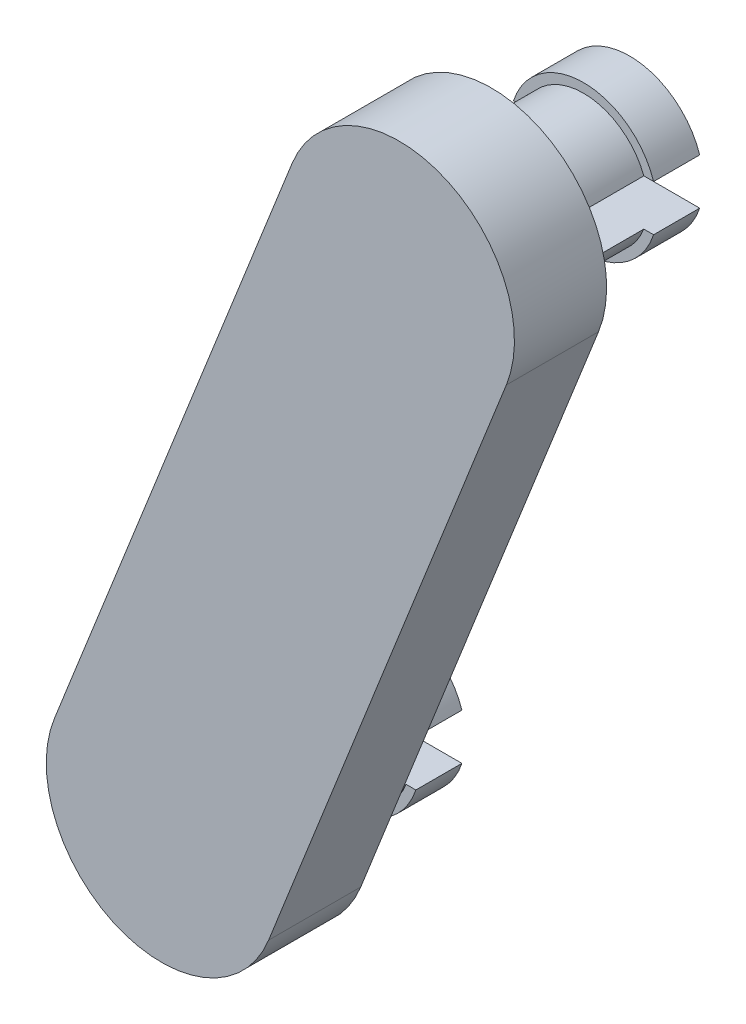
ISO-10303-21;
HEADER;
FILE_DESCRIPTION(('STEP AP214'),'2;1');
FILE_NAME('part.step','',(''),(''),'','','');
FILE_SCHEMA(('AUTOMOTIVE_DESIGN { 1 0 10303 214 1 1 1 1 }'));
ENDSEC;
DATA;
#1=APPLICATION_CONTEXT('core data for automotive mechanical design processes');
#2=APPLICATION_PROTOCOL_DEFINITION('international standard','automotive_design',2000,#1);
#3=PRODUCT_CONTEXT('',#1,'mechanical');
#4=PRODUCT('Part','Part','',(#3));
#5=PRODUCT_RELATED_PRODUCT_CATEGORY('part','',(#4));
#6=PRODUCT_DEFINITION_FORMATION('','',#4);
#7=PRODUCT_DEFINITION_CONTEXT('part definition',#1,'design');
#8=PRODUCT_DEFINITION('design','',#6,#7);
#9=PRODUCT_DEFINITION_SHAPE('','',#8);
#10=(LENGTH_UNIT() NAMED_UNIT(*) SI_UNIT(.MILLI.,.METRE.));
#11=(NAMED_UNIT(*) PLANE_ANGLE_UNIT() SI_UNIT($,.RADIAN.));
#12=(NAMED_UNIT(*) SI_UNIT($,.STERADIAN.) SOLID_ANGLE_UNIT());
#13=UNCERTAINTY_MEASURE_WITH_UNIT(LENGTH_MEASURE(1.E-05),#10,'distance_accuracy_value','');
#14=(GEOMETRIC_REPRESENTATION_CONTEXT(3) GLOBAL_UNCERTAINTY_ASSIGNED_CONTEXT((#13)) GLOBAL_UNIT_ASSIGNED_CONTEXT((#10,
#11,#12)) REPRESENTATION_CONTEXT('',''));
#15=CARTESIAN_POINT('',(0.,0.,0.));
#16=DIRECTION('',(0.,0.,1.));
#17=DIRECTION('',(1.,0.,0.));
#18=AXIS2_PLACEMENT_3D('',#15,#16,#17);
#19=CARTESIAN_POINT('',(-29.4174619075463,2.99646293108583,-2.));
#20=DIRECTION('',(0.,0.,1.));
#21=DIRECTION('',(1.,0.,0.));
#22=AXIS2_PLACEMENT_3D('',#19,#20,#21);
#23=CYLINDRICAL_SURFACE('',#22,1.4);
#24=DIRECTION('',(0.,0.,1.));
#25=VECTOR('',#24,1.);
#26=CARTESIAN_POINT('',(-28.1097922244841,3.49646293108583,-2.));
#27=LINE('',#26,#25);
#28=CARTESIAN_POINT('',(-28.1097922244841,3.49646293108583,-2.));
#29=VERTEX_POINT('',#28);
#30=CARTESIAN_POINT('',(-28.1097922244841,3.49646293108583,0.));
#31=VERTEX_POINT('',#30);
#32=EDGE_CURVE('E296',#29,#31,#27,.T.);
#33=ORIENTED_EDGE('',*,*,#32,.F.);
#34=CARTESIAN_POINT('',(-29.4174619075463,2.99646293108583,-2.));
#35=DIRECTION('',(0.,0.,-1.));
#36=DIRECTION('',(-1.,0.,0.));
#37=AXIS2_PLACEMENT_3D('',#34,#35,#36);
#38=CIRCLE('',#37,1.4);
#39=CARTESIAN_POINT('',(-30.7251315906085,3.49646293108583,-2.));
#40=VERTEX_POINT('',#39);
#41=EDGE_CURVE('E216',#40,#29,#38,.T.);
#42=ORIENTED_EDGE('',*,*,#41,.F.);
#43=DIRECTION('',(0.,0.,1.));
#44=VECTOR('',#43,1.);
#45=CARTESIAN_POINT('',(-30.7251315906085,3.49646293108583,-2.));
#46=LINE('',#45,#44);
#47=CARTESIAN_POINT('',(-30.7251315906085,3.49646293108583,0.));
#48=VERTEX_POINT('',#47);
#49=EDGE_CURVE('E52',#48,#40,#46,.F.);
#50=ORIENTED_EDGE('',*,*,#49,.F.);
#51=CARTESIAN_POINT('',(-29.4174619075463,2.99646293108583,0.));
#52=DIRECTION('',(0.,0.,1.));
#53=DIRECTION('',(1.,0.,0.));
#54=AXIS2_PLACEMENT_3D('',#51,#52,#53);
#55=CIRCLE('',#54,1.4);
#56=EDGE_CURVE('E249',#48,#31,#55,.F.);
#57=ORIENTED_EDGE('',*,*,#56,.T.);
#58=EDGE_LOOP('',(#33,#42,#50,#57));
#59=FACE_BOUND('',#58,.T.);
#60=ADVANCED_FACE('F37',(#59),#23,.T.);
#61=CARTESIAN_POINT('',(-34.5773236226365,-10.0179839292747,-2.));
#62=DIRECTION('',(0.,0.,1.));
#63=DIRECTION('',(1.,0.,0.));
#64=AXIS2_PLACEMENT_3D('',#61,#62,#63);
#65=CYLINDRICAL_SURFACE('',#64,1.4);
#66=DIRECTION('',(0.,0.,1.));
#67=VECTOR('',#66,1.);
#68=CARTESIAN_POINT('',(-33.2696539395743,-9.51798392927467,-2.));
#69=LINE('',#68,#67);
#70=CARTESIAN_POINT('',(-33.2696539395743,-9.51798392927467,-2.));
#71=VERTEX_POINT('',#70);
#72=CARTESIAN_POINT('',(-33.2696539395743,-9.51798392927467,0.));
#73=VERTEX_POINT('',#72);
#74=EDGE_CURVE('E191',#71,#73,#69,.T.);
#75=ORIENTED_EDGE('',*,*,#74,.F.);
#76=CARTESIAN_POINT('',(-34.5773236226365,-10.0179839292747,-2.));
#77=DIRECTION('',(0.,0.,-1.));
#78=DIRECTION('',(-1.,0.,0.));
#79=AXIS2_PLACEMENT_3D('',#76,#77,#78);
#80=CIRCLE('',#79,1.4);
#81=CARTESIAN_POINT('',(-35.8849933056987,-9.51798392927467,-2.));
#82=VERTEX_POINT('',#81);
#83=EDGE_CURVE('E212',#82,#71,#80,.T.);
#84=ORIENTED_EDGE('',*,*,#83,.F.);
#85=DIRECTION('',(0.,0.,1.));
#86=VECTOR('',#85,1.);
#87=CARTESIAN_POINT('',(-35.8849933056987,-9.51798392927467,-2.));
#88=LINE('',#87,#86);
#89=CARTESIAN_POINT('',(-35.8849933056987,-9.51798392927467,0.));
#90=VERTEX_POINT('',#89);
#91=EDGE_CURVE('E60',#90,#82,#88,.F.);
#92=ORIENTED_EDGE('',*,*,#91,.F.);
#93=CARTESIAN_POINT('',(-34.5773236226365,-10.0179839292747,0.));
#94=DIRECTION('',(0.,0.,1.));
#95=DIRECTION('',(1.,0.,0.));
#96=AXIS2_PLACEMENT_3D('',#93,#94,#95);
#97=CIRCLE('',#96,1.4);
#98=EDGE_CURVE('E253',#90,#73,#97,.F.);
#99=ORIENTED_EDGE('',*,*,#98,.T.);
#100=EDGE_LOOP('',(#75,#84,#92,#99));
#101=FACE_BOUND('',#100,.T.);
#102=ADVANCED_FACE('F337',(#101),#65,.T.);
#103=CARTESIAN_POINT('',(-29.4174619075463,2.99646293108583,-3.));
#104=DIRECTION('',(0.,0.,1.));
#105=DIRECTION('',(1.,0.,0.));
#106=AXIS2_PLACEMENT_3D('',#103,#104,#105);
#107=CYLINDRICAL_SURFACE('',#106,1.6);
#108=DIRECTION('',(0.,0.,1.));
#109=VECTOR('',#108,1.);
#110=CARTESIAN_POINT('',(-27.8975934921893,3.49646293108583,-3.));
#111=LINE('',#110,#109);
#112=CARTESIAN_POINT('',(-27.8975934921893,3.49646293108583,-3.));
#113=VERTEX_POINT('',#112);
#114=CARTESIAN_POINT('',(-27.8975934921893,3.49646293108583,-2.));
#115=VERTEX_POINT('',#114);
#116=EDGE_CURVE('E294',#113,#115,#111,.T.);
#117=ORIENTED_EDGE('',*,*,#116,.F.);
#118=CARTESIAN_POINT('',(-29.4174619075463,2.99646293108583,-3.));
#119=DIRECTION('',(0.,0.,-1.));
#120=DIRECTION('',(-1.,0.,0.));
#121=AXIS2_PLACEMENT_3D('',#118,#119,#120);
#122=CIRCLE('',#121,1.6);
#123=CARTESIAN_POINT('',(-30.9373303229034,3.49646293108583,-3.));
#124=VERTEX_POINT('',#123);
#125=EDGE_CURVE('E203',#124,#113,#122,.T.);
#126=ORIENTED_EDGE('',*,*,#125,.F.);
#127=DIRECTION('',(0.,0.,1.));
#128=VECTOR('',#127,1.);
#129=CARTESIAN_POINT('',(-30.9373303229034,3.49646293108583,-3.));
#130=LINE('',#129,#128);
#131=CARTESIAN_POINT('',(-30.9373303229034,3.49646293108583,-2.));
#132=VERTEX_POINT('',#131);
#133=EDGE_CURVE('E291',#132,#124,#130,.F.);
#134=ORIENTED_EDGE('',*,*,#133,.F.);
#135=CARTESIAN_POINT('',(-29.4174619075463,2.99646293108583,-2.));
#136=DIRECTION('',(0.,0.,-1.));
#137=DIRECTION('',(-1.,0.,0.));
#138=AXIS2_PLACEMENT_3D('',#135,#136,#137);
#139=CIRCLE('',#138,1.6);
#140=EDGE_CURVE('E208',#132,#115,#139,.T.);
#141=ORIENTED_EDGE('',*,*,#140,.T.);
#142=EDGE_LOOP('',(#117,#126,#134,#141));
#143=FACE_BOUND('',#142,.T.);
#144=ADVANCED_FACE('F372',(#143),#107,.T.);
#145=CARTESIAN_POINT('',(-29.4174619075463,2.99646293108583,-3.));
#146=DIRECTION('',(0.,0.,-1.));
#147=DIRECTION('',(-1.,0.,0.));
#148=AXIS2_PLACEMENT_3D('',#145,#146,#147);
#149=PLANE('',#148);
#150=ORIENTED_EDGE('',*,*,#125,.T.);
#151=DIRECTION('',(-1.,0.,0.));
#152=VECTOR('',#151,1.);
#153=CARTESIAN_POINT('',(-27.4174619075463,3.49646293108583,-3.));
#154=LINE('',#153,#152);
#155=EDGE_CURVE('E318',#113,#124,#154,.T.);
#156=ORIENTED_EDGE('',*,*,#155,.T.);
#157=EDGE_LOOP('',(#150,#156));
#158=FACE_BOUND('',#157,.T.);
#159=ADVANCED_FACE('F429',(#158),#149,.T.);
#160=CARTESIAN_POINT('',(-29.4174619075463,2.99646293108583,-2.));
#161=DIRECTION('',(0.,0.,-1.));
#162=DIRECTION('',(-1.,0.,0.));
#163=AXIS2_PLACEMENT_3D('',#160,#161,#162);
#164=PLANE('',#163);
#165=DIRECTION('',(-1.,0.,0.));
#166=VECTOR('',#165,1.);
#167=CARTESIAN_POINT('',(-29.4174619075463,3.49646293108583,-2.));
#168=LINE('',#167,#166);
#169=EDGE_CURVE('E264',#115,#29,#168,.T.);
#170=ORIENTED_EDGE('',*,*,#169,.F.);
#171=ORIENTED_EDGE('',*,*,#140,.F.);
#172=EDGE_CURVE('E263',#40,#132,#168,.T.);
#173=ORIENTED_EDGE('',*,*,#172,.F.);
#174=ORIENTED_EDGE('',*,*,#41,.T.);
#175=EDGE_LOOP('',(#170,#171,#173,#174));
#176=FACE_BOUND('',#175,.T.);
#177=ADVANCED_FACE('F432',(#176),#164,.F.);
#178=CARTESIAN_POINT('',(-34.5773236226365,-10.0179839292747,-3.));
#179=DIRECTION('',(0.,0.,1.));
#180=DIRECTION('',(1.,0.,0.));
#181=AXIS2_PLACEMENT_3D('',#178,#179,#180);
#182=CYLINDRICAL_SURFACE('',#181,1.6);
#183=DIRECTION('',(0.,0.,1.));
#184=VECTOR('',#183,1.);
#185=CARTESIAN_POINT('',(-33.0574552072794,-9.51798392927467,-3.));
#186=LINE('',#185,#184);
#187=CARTESIAN_POINT('',(-33.0574552072794,-9.51798392927467,-3.));
#188=VERTEX_POINT('',#187);
#189=CARTESIAN_POINT('',(-33.0574552072794,-9.51798392927467,-2.));
#190=VERTEX_POINT('',#189);
#191=EDGE_CURVE('E175',#188,#190,#186,.T.);
#192=ORIENTED_EDGE('',*,*,#191,.F.);
#193=CARTESIAN_POINT('',(-34.5773236226365,-10.0179839292747,-3.));
#194=DIRECTION('',(0.,0.,-1.));
#195=DIRECTION('',(-1.,0.,0.));
#196=AXIS2_PLACEMENT_3D('',#193,#194,#195);
#197=CIRCLE('',#196,1.6);
#198=CARTESIAN_POINT('',(-36.0971920379935,-9.51798392927467,-3.));
#199=VERTEX_POINT('',#198);
#200=EDGE_CURVE('E188',#199,#188,#197,.T.);
#201=ORIENTED_EDGE('',*,*,#200,.F.);
#202=DIRECTION('',(0.,0.,1.));
#203=VECTOR('',#202,1.);
#204=CARTESIAN_POINT('',(-36.0971920379935,-9.51798392927467,-3.));
#205=LINE('',#204,#203);
#206=CARTESIAN_POINT('',(-36.0971920379935,-9.51798392927467,-2.));
#207=VERTEX_POINT('',#206);
#208=EDGE_CURVE('E178',#207,#199,#205,.F.);
#209=ORIENTED_EDGE('',*,*,#208,.F.);
#210=CARTESIAN_POINT('',(-34.5773236226365,-10.0179839292747,-2.));
#211=DIRECTION('',(0.,0.,-1.));
#212=DIRECTION('',(-1.,0.,0.));
#213=AXIS2_PLACEMENT_3D('',#210,#211,#212);
#214=CIRCLE('',#213,1.6);
#215=EDGE_CURVE('E190',#207,#190,#214,.T.);
#216=ORIENTED_EDGE('',*,*,#215,.T.);
#217=EDGE_LOOP('',(#192,#201,#209,#216));
#218=FACE_BOUND('',#217,.T.);
#219=ADVANCED_FACE('F187',(#218),#182,.T.);
#220=CARTESIAN_POINT('',(-34.5773236226365,-10.0179839292747,-3.));
#221=DIRECTION('',(0.,0.,-1.));
#222=DIRECTION('',(-1.,0.,0.));
#223=AXIS2_PLACEMENT_3D('',#220,#221,#222);
#224=PLANE('',#223);
#225=ORIENTED_EDGE('',*,*,#200,.T.);
#226=DIRECTION('',(-1.,0.,0.));
#227=VECTOR('',#226,1.);
#228=CARTESIAN_POINT('',(-32.5773236226365,-9.51798392927467,-3.));
#229=LINE('',#228,#227);
#230=EDGE_CURVE('E172',#188,#199,#229,.T.);
#231=ORIENTED_EDGE('',*,*,#230,.T.);
#232=EDGE_LOOP('',(#225,#231));
#233=FACE_BOUND('',#232,.T.);
#234=ADVANCED_FACE('F193',(#233),#224,.T.);
#235=CARTESIAN_POINT('',(-34.5773236226365,-10.0179839292747,-2.));
#236=DIRECTION('',(0.,0.,-1.));
#237=DIRECTION('',(-1.,0.,0.));
#238=AXIS2_PLACEMENT_3D('',#235,#236,#237);
#239=PLANE('',#238);
#240=DIRECTION('',(-1.,0.,0.));
#241=VECTOR('',#240,1.);
#242=CARTESIAN_POINT('',(-34.5773236226365,-9.51798392927467,-2.));
#243=LINE('',#242,#241);
#244=EDGE_CURVE('E259',#190,#71,#243,.T.);
#245=ORIENTED_EDGE('',*,*,#244,.F.);
#246=ORIENTED_EDGE('',*,*,#215,.F.);
#247=EDGE_CURVE('E257',#82,#207,#243,.T.);
#248=ORIENTED_EDGE('',*,*,#247,.F.);
#249=ORIENTED_EDGE('',*,*,#83,.T.);
#250=EDGE_LOOP('',(#245,#246,#248,#249));
#251=FACE_BOUND('',#250,.T.);
#252=ADVANCED_FACE('F339',(#251),#239,.F.);
#253=CARTESIAN_POINT('',(-29.4174619075463,2.99646293108583,2.));
#254=DIRECTION('',(0.,0.,-1.));
#255=DIRECTION('',(-1.,0.,0.));
#256=AXIS2_PLACEMENT_3D('',#253,#254,#255);
#257=CYLINDRICAL_SURFACE('',#256,2.5);
#258=CARTESIAN_POINT('',(-29.4174619075463,2.99646293108583,0.));
#259=DIRECTION('',(0.,0.,1.));
#260=DIRECTION('',(1.,0.,0.));
#261=AXIS2_PLACEMENT_3D('',#258,#259,#260);
#262=CIRCLE('',#261,2.5);
#263=CARTESIAN_POINT('',(-27.0934535396248,2.07505905339117,0.));
#264=VERTEX_POINT('',#263);
#265=CARTESIAN_POINT('',(-31.7414702754679,3.9178668087805,0.));
#266=VERTEX_POINT('',#265);
#267=EDGE_CURVE('E219',#264,#266,#262,.T.);
#268=ORIENTED_EDGE('',*,*,#267,.T.);
#269=DIRECTION('',(0.,0.,-1.));
#270=VECTOR('',#269,1.);
#271=CARTESIAN_POINT('',(-31.7414702754679,3.9178668087805,2.));
#272=LINE('',#271,#270);
#273=CARTESIAN_POINT('',(-31.7414702754679,3.9178668087805,2.));
#274=VERTEX_POINT('',#273);
#275=EDGE_CURVE('E246',#274,#266,#272,.T.);
#276=ORIENTED_EDGE('',*,*,#275,.F.);
#277=CARTESIAN_POINT('',(-29.4174619075463,2.99646293108583,2.));
#278=DIRECTION('',(0.,0.,1.));
#279=DIRECTION('',(1.,0.,0.));
#280=AXIS2_PLACEMENT_3D('',#277,#278,#279);
#281=CIRCLE('',#280,2.5);
#282=CARTESIAN_POINT('',(-27.0934535396248,2.07505905339117,2.));
#283=VERTEX_POINT('',#282);
#284=EDGE_CURVE('E220',#283,#274,#281,.T.);
#285=ORIENTED_EDGE('',*,*,#284,.F.);
#286=DIRECTION('',(0.,0.,-1.));
#287=VECTOR('',#286,1.);
#288=CARTESIAN_POINT('',(-27.0934535396248,2.07505905339117,2.));
#289=LINE('',#288,#287);
#290=EDGE_CURVE('E230',#283,#264,#289,.T.);
#291=ORIENTED_EDGE('',*,*,#290,.T.);
#292=EDGE_LOOP('',(#268,#276,#285,#291));
#293=FACE_BOUND('',#292,.T.);
#294=ADVANCED_FACE('F39',(#293),#257,.T.);
#295=CARTESIAN_POINT('',(-31.7414702754679,3.9178668087805,2.));
#296=DIRECTION('',(0.929603347168607,-0.368561551077866,0.));
#297=DIRECTION('',(0.368561551077866,0.929603347168607,0.));
#298=AXIS2_PLACEMENT_3D('',#295,#296,#297);
#299=PLANE('',#298);
#300=DIRECTION('',(-0.368561551077866,-0.929603347168607,0.));
#301=VECTOR('',#300,1.);
#302=CARTESIAN_POINT('',(-31.7414702754679,3.9178668087805,0.));
#303=LINE('',#302,#301);
#304=CARTESIAN_POINT('',(-36.901331990558,-9.09658005158,0.));
#305=VERTEX_POINT('',#304);
#306=EDGE_CURVE('E233',#266,#305,#303,.T.);
#307=ORIENTED_EDGE('',*,*,#306,.T.);
#308=DIRECTION('',(0.,0.,-1.));
#309=VECTOR('',#308,1.);
#310=CARTESIAN_POINT('',(-36.901331990558,-9.09658005158,2.));
#311=LINE('',#310,#309);
#312=CARTESIAN_POINT('',(-36.901331990558,-9.09658005158,2.));
#313=VERTEX_POINT('',#312);
#314=EDGE_CURVE('E243',#313,#305,#311,.T.);
#315=ORIENTED_EDGE('',*,*,#314,.F.);
#316=DIRECTION('',(-0.368561551077866,-0.929603347168607,0.));
#317=VECTOR('',#316,1.);
#318=CARTESIAN_POINT('',(-31.7414702754679,3.9178668087805,2.));
#319=LINE('',#318,#317);
#320=EDGE_CURVE('E223',#274,#313,#319,.T.);
#321=ORIENTED_EDGE('',*,*,#320,.F.);
#322=ORIENTED_EDGE('',*,*,#275,.T.);
#323=EDGE_LOOP('',(#307,#315,#321,#322));
#324=FACE_BOUND('',#323,.T.);
#325=ADVANCED_FACE('F394',(#324),#299,.F.);
#326=CARTESIAN_POINT('',(-34.5773236226365,-10.0179839292747,2.));
#327=DIRECTION('',(0.,0.,-1.));
#328=DIRECTION('',(-1.,0.,0.));
#329=AXIS2_PLACEMENT_3D('',#326,#327,#328);
#330=CYLINDRICAL_SURFACE('',#329,2.50000000000001);
#331=CARTESIAN_POINT('',(-34.5773236226365,-10.0179839292747,0.));
#332=DIRECTION('',(0.,0.,1.));
#333=DIRECTION('',(1.,0.,0.));
#334=AXIS2_PLACEMENT_3D('',#331,#332,#333);
#335=CIRCLE('',#334,2.50000000000001);
#336=CARTESIAN_POINT('',(-32.2533152547149,-10.9393878069693,0.));
#337=VERTEX_POINT('',#336);
#338=EDGE_CURVE('E235',#305,#337,#335,.T.);
#339=ORIENTED_EDGE('',*,*,#338,.T.);
#340=DIRECTION('',(0.,0.,-1.));
#341=VECTOR('',#340,1.);
#342=CARTESIAN_POINT('',(-32.2533152547149,-10.9393878069693,2.));
#343=LINE('',#342,#341);
#344=CARTESIAN_POINT('',(-32.2533152547149,-10.9393878069693,2.));
#345=VERTEX_POINT('',#344);
#346=EDGE_CURVE('E240',#345,#337,#343,.T.);
#347=ORIENTED_EDGE('',*,*,#346,.F.);
#348=CARTESIAN_POINT('',(-34.5773236226365,-10.0179839292747,2.));
#349=DIRECTION('',(0.,0.,1.));
#350=DIRECTION('',(1.,0.,0.));
#351=AXIS2_PLACEMENT_3D('',#348,#349,#350);
#352=CIRCLE('',#351,2.50000000000001);
#353=EDGE_CURVE('E226',#313,#345,#352,.T.);
#354=ORIENTED_EDGE('',*,*,#353,.F.);
#355=ORIENTED_EDGE('',*,*,#314,.T.);
#356=EDGE_LOOP('',(#339,#347,#354,#355));
#357=FACE_BOUND('',#356,.T.);
#358=ADVANCED_FACE('F391',(#357),#330,.T.);
#359=CARTESIAN_POINT('',(-27.0934535396248,2.07505905339117,2.));
#360=DIRECTION('',(-0.929603347168607,0.368561551077866,0.));
#361=DIRECTION('',(-0.368561551077866,-0.929603347168607,0.));
#362=AXIS2_PLACEMENT_3D('',#359,#360,#361);
#363=PLANE('',#362);
#364=DIRECTION('',(0.368561551077866,0.929603347168607,0.));
#365=VECTOR('',#364,1.);
#366=CARTESIAN_POINT('',(-27.0934535396248,2.07505905339117,0.));
#367=LINE('',#366,#365);
#368=EDGE_CURVE('E224',#337,#264,#367,.T.);
#369=ORIENTED_EDGE('',*,*,#368,.T.);
#370=ORIENTED_EDGE('',*,*,#290,.F.);
#371=DIRECTION('',(0.368561551077866,0.929603347168607,0.));
#372=VECTOR('',#371,1.);
#373=CARTESIAN_POINT('',(-27.0934535396248,2.07505905339117,2.));
#374=LINE('',#373,#372);
#375=EDGE_CURVE('E228',#345,#283,#374,.T.);
#376=ORIENTED_EDGE('',*,*,#375,.F.);
#377=ORIENTED_EDGE('',*,*,#346,.T.);
#378=EDGE_LOOP('',(#369,#370,#376,#377));
#379=FACE_BOUND('',#378,.T.);
#380=ADVANCED_FACE('F386',(#379),#363,.F.);
#381=CARTESIAN_POINT('',(-29.4174619075463,2.99646293108583,2.));
#382=DIRECTION('',(0.,0.,1.));
#383=DIRECTION('',(1.,0.,0.));
#384=AXIS2_PLACEMENT_3D('',#381,#382,#383);
#385=PLANE('',#384);
#386=ORIENTED_EDGE('',*,*,#284,.T.);
#387=ORIENTED_EDGE('',*,*,#320,.T.);
#388=ORIENTED_EDGE('',*,*,#353,.T.);
#389=ORIENTED_EDGE('',*,*,#375,.T.);
#390=EDGE_LOOP('',(#386,#387,#388,#389));
#391=FACE_BOUND('',#390,.T.);
#392=ADVANCED_FACE('F381',(#391),#385,.T.);
#393=CARTESIAN_POINT('',(-29.4174619075463,2.99646293108583,0.));
#394=DIRECTION('',(0.,0.,1.));
#395=DIRECTION('',(1.,0.,0.));
#396=AXIS2_PLACEMENT_3D('',#393,#394,#395);
#397=PLANE('',#396);
#398=DIRECTION('',(-1.,0.,0.));
#399=VECTOR('',#398,1.);
#400=CARTESIAN_POINT('',(-32.5773236226365,-10.5179839292747,0.));
#401=LINE('',#400,#399);
#402=CARTESIAN_POINT('',(-33.2696539395743,-10.5179839292747,0.));
#403=VERTEX_POINT('',#402);
#404=CARTESIAN_POINT('',(-35.8849933056987,-10.5179839292747,0.));
#405=VERTEX_POINT('',#404);
#406=EDGE_CURVE('E182',#403,#405,#401,.T.);
#407=ORIENTED_EDGE('',*,*,#406,.T.);
#408=EDGE_CURVE('E254',#403,#405,#97,.F.);
#409=ORIENTED_EDGE('',*,*,#408,.F.);
#410=EDGE_LOOP('',(#407,#409));
#411=FACE_BOUND('',#410,.T.);
#412=ORIENTED_EDGE('',*,*,#98,.F.);
#413=DIRECTION('',(-1.,0.,0.));
#414=VECTOR('',#413,1.);
#415=CARTESIAN_POINT('',(-32.5773236226365,-9.51798392927467,0.));
#416=LINE('',#415,#414);
#417=EDGE_CURVE('E328',#73,#90,#416,.T.);
#418=ORIENTED_EDGE('',*,*,#417,.F.);
#419=EDGE_LOOP('',(#412,#418));
#420=FACE_BOUND('',#419,.T.);
#421=DIRECTION('',(-1.,0.,0.));
#422=VECTOR('',#421,1.);
#423=CARTESIAN_POINT('',(-27.4174619075463,2.49646293108583,0.));
#424=LINE('',#423,#422);
#425=CARTESIAN_POINT('',(-28.1097922244841,2.49646293108583,0.));
#426=VERTEX_POINT('',#425);
#427=CARTESIAN_POINT('',(-30.7251315906085,2.49646293108583,0.));
#428=VERTEX_POINT('',#427);
#429=EDGE_CURVE('E317',#426,#428,#424,.T.);
#430=ORIENTED_EDGE('',*,*,#429,.T.);
#431=EDGE_CURVE('E250',#426,#428,#55,.F.);
#432=ORIENTED_EDGE('',*,*,#431,.F.);
#433=EDGE_LOOP('',(#430,#432));
#434=FACE_BOUND('',#433,.T.);
#435=ORIENTED_EDGE('',*,*,#56,.F.);
#436=DIRECTION('',(-1.,0.,0.));
#437=VECTOR('',#436,1.);
#438=CARTESIAN_POINT('',(-27.4174619075463,3.49646293108583,0.));
#439=LINE('',#438,#437);
#440=EDGE_CURVE('E319',#31,#48,#439,.T.);
#441=ORIENTED_EDGE('',*,*,#440,.F.);
#442=EDGE_LOOP('',(#435,#441));
#443=FACE_BOUND('',#442,.T.);
#444=ORIENTED_EDGE('',*,*,#267,.F.);
#445=ORIENTED_EDGE('',*,*,#368,.F.);
#446=ORIENTED_EDGE('',*,*,#338,.F.);
#447=ORIENTED_EDGE('',*,*,#306,.F.);
#448=EDGE_LOOP('',(#444,#445,#446,#447));
#449=FACE_BOUND('',#448,.T.);
#450=ADVANCED_FACE('F315',(#411,#420,#434,#443,#449),#397,.F.);
#451=CARTESIAN_POINT('',(-28.1097922244841,2.49646293108583,-2.));
#452=VERTEX_POINT('',#451);
#453=CARTESIAN_POINT('',(-30.7251315906085,2.49646293108583,-2.));
#454=VERTEX_POINT('',#453);
#455=EDGE_CURVE('E215',#452,#454,#38,.T.);
#456=ORIENTED_EDGE('',*,*,#455,.F.);
#457=DIRECTION('',(0.,0.,1.));
#458=VECTOR('',#457,1.);
#459=CARTESIAN_POINT('',(-28.1097922244841,2.49646293108583,-2.));
#460=LINE('',#459,#458);
#461=EDGE_CURVE('E200',#452,#426,#460,.T.);
#462=ORIENTED_EDGE('',*,*,#461,.T.);
#463=ORIENTED_EDGE('',*,*,#431,.T.);
#464=DIRECTION('',(0.,0.,1.));
#465=VECTOR('',#464,1.);
#466=CARTESIAN_POINT('',(-30.7251315906085,2.49646293108583,-2.));
#467=LINE('',#466,#465);
#468=EDGE_CURVE('E301',#428,#454,#467,.F.);
#469=ORIENTED_EDGE('',*,*,#468,.T.);
#470=EDGE_LOOP('',(#456,#462,#463,#469));
#471=FACE_BOUND('',#470,.T.);
#472=ADVANCED_FACE('F310',(#471),#23,.T.);
#473=CARTESIAN_POINT('',(-33.2696539395743,-10.5179839292747,-2.));
#474=VERTEX_POINT('',#473);
#475=CARTESIAN_POINT('',(-35.8849933056987,-10.5179839292747,-2.));
#476=VERTEX_POINT('',#475);
#477=EDGE_CURVE('E206',#474,#476,#80,.T.);
#478=ORIENTED_EDGE('',*,*,#477,.F.);
#479=DIRECTION('',(0.,0.,1.));
#480=VECTOR('',#479,1.);
#481=CARTESIAN_POINT('',(-33.2696539395743,-10.5179839292747,-2.));
#482=LINE('',#481,#480);
#483=EDGE_CURVE('E278',#474,#403,#482,.T.);
#484=ORIENTED_EDGE('',*,*,#483,.T.);
#485=ORIENTED_EDGE('',*,*,#408,.T.);
#486=DIRECTION('',(0.,0.,1.));
#487=VECTOR('',#486,1.);
#488=CARTESIAN_POINT('',(-35.8849933056987,-10.5179839292747,-2.));
#489=LINE('',#488,#487);
#490=EDGE_CURVE('E280',#405,#476,#489,.F.);
#491=ORIENTED_EDGE('',*,*,#490,.T.);
#492=EDGE_LOOP('',(#478,#484,#485,#491));
#493=FACE_BOUND('',#492,.T.);
#494=ADVANCED_FACE('F277',(#493),#65,.T.);
#495=CARTESIAN_POINT('',(-27.8975934921893,2.49646293108583,-3.));
#496=VERTEX_POINT('',#495);
#497=CARTESIAN_POINT('',(-30.9373303229034,2.49646293108583,-3.));
#498=VERTEX_POINT('',#497);
#499=EDGE_CURVE('E207',#496,#498,#122,.T.);
#500=ORIENTED_EDGE('',*,*,#499,.F.);
#501=DIRECTION('',(0.,0.,1.));
#502=VECTOR('',#501,1.);
#503=CARTESIAN_POINT('',(-27.8975934921893,2.49646293108583,-3.));
#504=LINE('',#503,#502);
#505=CARTESIAN_POINT('',(-27.8975934921893,2.49646293108583,-2.));
#506=VERTEX_POINT('',#505);
#507=EDGE_CURVE('E304',#496,#506,#504,.T.);
#508=ORIENTED_EDGE('',*,*,#507,.T.);
#509=CARTESIAN_POINT('',(-30.9373303229034,2.49646293108583,-2.));
#510=VERTEX_POINT('',#509);
#511=EDGE_CURVE('E211',#506,#510,#139,.T.);
#512=ORIENTED_EDGE('',*,*,#511,.T.);
#513=DIRECTION('',(0.,0.,1.));
#514=VECTOR('',#513,1.);
#515=CARTESIAN_POINT('',(-30.9373303229034,2.49646293108583,-3.));
#516=LINE('',#515,#514);
#517=EDGE_CURVE('E298',#510,#498,#516,.F.);
#518=ORIENTED_EDGE('',*,*,#517,.T.);
#519=EDGE_LOOP('',(#500,#508,#512,#518));
#520=FACE_BOUND('',#519,.T.);
#521=ADVANCED_FACE('F344',(#520),#107,.T.);
#522=DIRECTION('',(-1.,0.,0.));
#523=VECTOR('',#522,1.);
#524=CARTESIAN_POINT('',(-27.4174619075463,2.49646293108583,-3.));
#525=LINE('',#524,#523);
#526=EDGE_CURVE('E322',#496,#498,#525,.T.);
#527=ORIENTED_EDGE('',*,*,#526,.F.);
#528=ORIENTED_EDGE('',*,*,#499,.T.);
#529=EDGE_LOOP('',(#527,#528));
#530=FACE_BOUND('',#529,.T.);
#531=ADVANCED_FACE('F426',(#530),#149,.T.);
#532=ORIENTED_EDGE('',*,*,#511,.F.);
#533=DIRECTION('',(-1.,0.,0.));
#534=VECTOR('',#533,1.);
#535=CARTESIAN_POINT('',(-29.4174619075463,2.49646293108583,-2.));
#536=LINE('',#535,#534);
#537=EDGE_CURVE('E11',#506,#452,#536,.T.);
#538=ORIENTED_EDGE('',*,*,#537,.T.);
#539=ORIENTED_EDGE('',*,*,#455,.T.);
#540=EDGE_CURVE('E41',#454,#510,#536,.T.);
#541=ORIENTED_EDGE('',*,*,#540,.T.);
#542=EDGE_LOOP('',(#532,#538,#539,#541));
#543=FACE_BOUND('',#542,.T.);
#544=ADVANCED_FACE('F348',(#543),#164,.F.);
#545=CARTESIAN_POINT('',(-33.0574552072794,-10.5179839292747,-3.));
#546=VERTEX_POINT('',#545);
#547=CARTESIAN_POINT('',(-36.0971920379935,-10.5179839292747,-3.));
#548=VERTEX_POINT('',#547);
#549=EDGE_CURVE('E195',#546,#548,#197,.T.);
#550=ORIENTED_EDGE('',*,*,#549,.F.);
#551=DIRECTION('',(0.,0.,1.));
#552=VECTOR('',#551,1.);
#553=CARTESIAN_POINT('',(-33.0574552072794,-10.5179839292747,-3.));
#554=LINE('',#553,#552);
#555=CARTESIAN_POINT('',(-33.0574552072794,-10.5179839292747,-2.));
#556=VERTEX_POINT('',#555);
#557=EDGE_CURVE('E282',#546,#556,#554,.T.);
#558=ORIENTED_EDGE('',*,*,#557,.T.);
#559=CARTESIAN_POINT('',(-36.0971920379935,-10.5179839292747,-2.));
#560=VERTEX_POINT('',#559);
#561=EDGE_CURVE('E194',#556,#560,#214,.T.);
#562=ORIENTED_EDGE('',*,*,#561,.T.);
#563=DIRECTION('',(0.,0.,1.));
#564=VECTOR('',#563,1.);
#565=CARTESIAN_POINT('',(-36.0971920379935,-10.5179839292747,-3.));
#566=LINE('',#565,#564);
#567=EDGE_CURVE('E283',#560,#548,#566,.F.);
#568=ORIENTED_EDGE('',*,*,#567,.T.);
#569=EDGE_LOOP('',(#550,#558,#562,#568));
#570=FACE_BOUND('',#569,.T.);
#571=ADVANCED_FACE('F421',(#570),#182,.T.);
#572=DIRECTION('',(-1.,0.,0.));
#573=VECTOR('',#572,1.);
#574=CARTESIAN_POINT('',(-32.5773236226365,-10.5179839292747,-3.));
#575=LINE('',#574,#573);
#576=EDGE_CURVE('E183',#546,#548,#575,.T.);
#577=ORIENTED_EDGE('',*,*,#576,.F.);
#578=ORIENTED_EDGE('',*,*,#549,.T.);
#579=EDGE_LOOP('',(#577,#578));
#580=FACE_BOUND('',#579,.T.);
#581=ADVANCED_FACE('F363',(#580),#224,.T.);
#582=ORIENTED_EDGE('',*,*,#561,.F.);
#583=DIRECTION('',(-1.,0.,0.));
#584=VECTOR('',#583,1.);
#585=CARTESIAN_POINT('',(-34.5773236226365,-10.5179839292747,-2.));
#586=LINE('',#585,#584);
#587=EDGE_CURVE('E262',#556,#474,#586,.T.);
#588=ORIENTED_EDGE('',*,*,#587,.T.);
#589=ORIENTED_EDGE('',*,*,#477,.T.);
#590=EDGE_CURVE('E260',#476,#560,#586,.T.);
#591=ORIENTED_EDGE('',*,*,#590,.T.);
#592=EDGE_LOOP('',(#582,#588,#589,#591));
#593=FACE_BOUND('',#592,.T.);
#594=ADVANCED_FACE('F271',(#593),#239,.F.);
#595=CARTESIAN_POINT('',(-32.5773236226365,-10.5179839292747,0.));
#596=DIRECTION('',(0.,-1.,0.));
#597=DIRECTION('',(0.,0.,-1.));
#598=AXIS2_PLACEMENT_3D('',#595,#596,#597);
#599=PLANE('',#598);
#600=ORIENTED_EDGE('',*,*,#587,.F.);
#601=ORIENTED_EDGE('',*,*,#557,.F.);
#602=ORIENTED_EDGE('',*,*,#576,.T.);
#603=ORIENTED_EDGE('',*,*,#567,.F.);
#604=ORIENTED_EDGE('',*,*,#590,.F.);
#605=ORIENTED_EDGE('',*,*,#490,.F.);
#606=ORIENTED_EDGE('',*,*,#406,.F.);
#607=ORIENTED_EDGE('',*,*,#483,.F.);
#608=EDGE_LOOP('',(#600,#601,#602,#603,#604,#605,#606,#607));
#609=FACE_BOUND('',#608,.T.);
#610=ADVANCED_FACE('F355',(#609),#599,.F.);
#611=CARTESIAN_POINT('',(-32.5773236226365,-9.51798392927467,0.));
#612=DIRECTION('',(0.,-1.,0.));
#613=DIRECTION('',(0.,0.,-1.));
#614=AXIS2_PLACEMENT_3D('',#611,#612,#613);
#615=PLANE('',#614);
#616=ORIENTED_EDGE('',*,*,#74,.T.);
#617=ORIENTED_EDGE('',*,*,#417,.T.);
#618=ORIENTED_EDGE('',*,*,#91,.T.);
#619=ORIENTED_EDGE('',*,*,#247,.T.);
#620=ORIENTED_EDGE('',*,*,#208,.T.);
#621=ORIENTED_EDGE('',*,*,#230,.F.);
#622=ORIENTED_EDGE('',*,*,#191,.T.);
#623=ORIENTED_EDGE('',*,*,#244,.T.);
#624=EDGE_LOOP('',(#616,#617,#618,#619,#620,#621,#622,#623));
#625=FACE_BOUND('',#624,.T.);
#626=ADVANCED_FACE('F174',(#625),#615,.T.);
#627=CARTESIAN_POINT('',(-27.4174619075463,2.49646293108583,0.));
#628=DIRECTION('',(0.,-1.,0.));
#629=DIRECTION('',(0.,0.,-1.));
#630=AXIS2_PLACEMENT_3D('',#627,#628,#629);
#631=PLANE('',#630);
#632=ORIENTED_EDGE('',*,*,#537,.F.);
#633=ORIENTED_EDGE('',*,*,#507,.F.);
#634=ORIENTED_EDGE('',*,*,#526,.T.);
#635=ORIENTED_EDGE('',*,*,#517,.F.);
#636=ORIENTED_EDGE('',*,*,#540,.F.);
#637=ORIENTED_EDGE('',*,*,#468,.F.);
#638=ORIENTED_EDGE('',*,*,#429,.F.);
#639=ORIENTED_EDGE('',*,*,#461,.F.);
#640=EDGE_LOOP('',(#632,#633,#634,#635,#636,#637,#638,#639));
#641=FACE_BOUND('',#640,.T.);
#642=ADVANCED_FACE('F349',(#641),#631,.F.);
#643=CARTESIAN_POINT('',(-27.4174619075463,3.49646293108583,0.));
#644=DIRECTION('',(0.,-1.,0.));
#645=DIRECTION('',(0.,0.,-1.));
#646=AXIS2_PLACEMENT_3D('',#643,#644,#645);
#647=PLANE('',#646);
#648=ORIENTED_EDGE('',*,*,#32,.T.);
#649=ORIENTED_EDGE('',*,*,#440,.T.);
#650=ORIENTED_EDGE('',*,*,#49,.T.);
#651=ORIENTED_EDGE('',*,*,#172,.T.);
#652=ORIENTED_EDGE('',*,*,#133,.T.);
#653=ORIENTED_EDGE('',*,*,#155,.F.);
#654=ORIENTED_EDGE('',*,*,#116,.T.);
#655=ORIENTED_EDGE('',*,*,#169,.T.);
#656=EDGE_LOOP('',(#648,#649,#650,#651,#652,#653,#654,#655));
#657=FACE_BOUND('',#656,.T.);
#658=ADVANCED_FACE('F446',(#657),#647,.T.);
#659=CLOSED_SHELL('',(#60,#102,#144,#159,#177,#219,#234,#252,#294,#325,#358,#380,#392,#450,#472,
#494,#521,#531,#544,#571,#581,#594,#610,#626,#642,#658));
#660=MANIFOLD_SOLID_BREP('B2',#659);
#661=ADVANCED_BREP_SHAPE_REPRESENTATION('',(#18,#660),#14);
#662=SHAPE_DEFINITION_REPRESENTATION(#9,#661);
ENDSEC;
END-ISO-10303-21;
